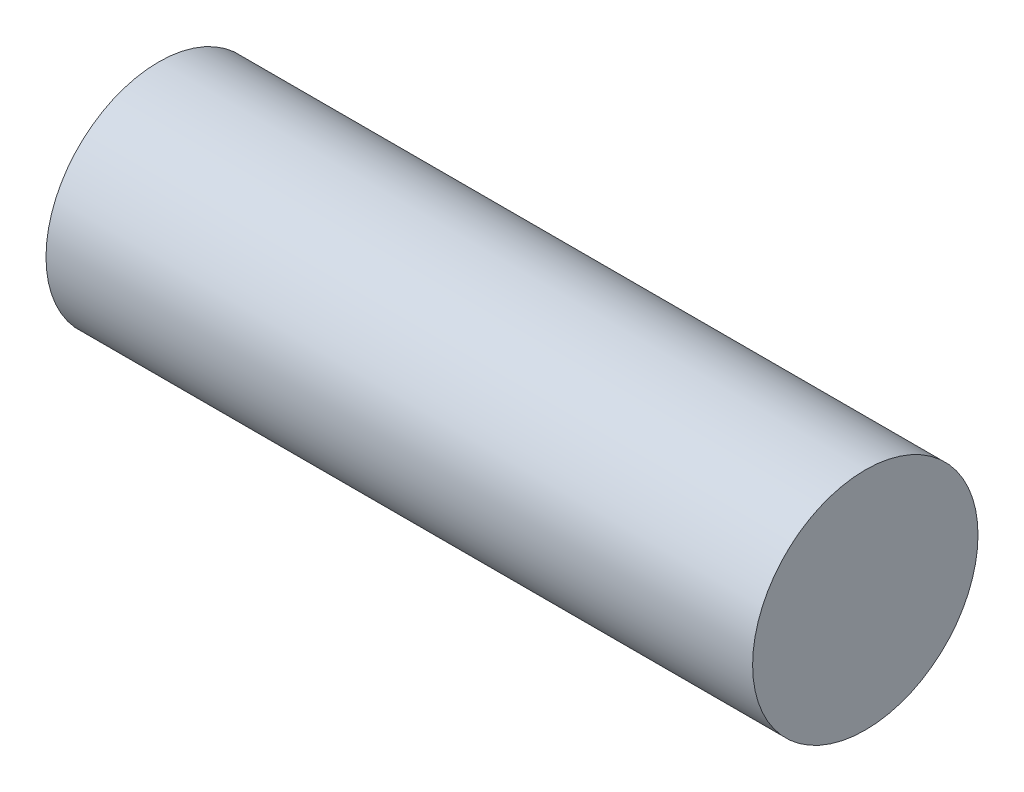
ISO-10303-21;
HEADER;
FILE_DESCRIPTION(('STEP AP214'),'2;1');
FILE_NAME('part.step','',(''),(''),'','','');
FILE_SCHEMA(('AUTOMOTIVE_DESIGN { 1 0 10303 214 1 1 1 1 }'));
ENDSEC;
DATA;
#1=APPLICATION_CONTEXT('core data for automotive mechanical design processes');
#2=APPLICATION_PROTOCOL_DEFINITION('international standard','automotive_design',2000,#1);
#3=PRODUCT_CONTEXT('',#1,'mechanical');
#4=PRODUCT('Part','Part','',(#3));
#5=PRODUCT_RELATED_PRODUCT_CATEGORY('part','',(#4));
#6=PRODUCT_DEFINITION_FORMATION('','',#4);
#7=PRODUCT_DEFINITION_CONTEXT('part definition',#1,'design');
#8=PRODUCT_DEFINITION('design','',#6,#7);
#9=PRODUCT_DEFINITION_SHAPE('','',#8);
#10=(LENGTH_UNIT() NAMED_UNIT(*) SI_UNIT(.MILLI.,.METRE.));
#11=(NAMED_UNIT(*) PLANE_ANGLE_UNIT() SI_UNIT($,.RADIAN.));
#12=(NAMED_UNIT(*) SI_UNIT($,.STERADIAN.) SOLID_ANGLE_UNIT());
#13=UNCERTAINTY_MEASURE_WITH_UNIT(LENGTH_MEASURE(1.E-05),#10,'distance_accuracy_value','');
#14=(GEOMETRIC_REPRESENTATION_CONTEXT(3) GLOBAL_UNCERTAINTY_ASSIGNED_CONTEXT((#13)) GLOBAL_UNIT_ASSIGNED_CONTEXT((#10,
#11,#12)) REPRESENTATION_CONTEXT('',''));
#15=CARTESIAN_POINT('',(0.,0.,0.));
#16=DIRECTION('',(0.,0.,1.));
#17=DIRECTION('',(1.,0.,0.));
#18=AXIS2_PLACEMENT_3D('',#15,#16,#17);
#19=CARTESIAN_POINT('',(58.,0.,0.));
#20=DIRECTION('',(-1.,0.,0.));
#21=DIRECTION('',(0.,0.,1.));
#22=AXIS2_PLACEMENT_3D('',#19,#20,#21);
#23=CYLINDRICAL_SURFACE('',#22,9.25);
#24=CARTESIAN_POINT('',(58.,0.,0.));
#25=DIRECTION('',(1.,0.,0.));
#26=DIRECTION('',(0.,0.,-1.));
#27=AXIS2_PLACEMENT_3D('',#24,#25,#26);
#28=CIRCLE('',#27,9.25);
#29=CARTESIAN_POINT('',(58.,0.,9.25));
#30=VERTEX_POINT('',#29);
#31=EDGE_CURVE('E45',#30,#30,#28,.T.);
#32=CARTESIAN_POINT('',(0.,0.,0.));
#33=DIRECTION('',(1.,0.,0.));
#34=DIRECTION('',(0.,0.,-1.));
#35=AXIS2_PLACEMENT_3D('',#32,#33,#34);
#36=CIRCLE('',#35,9.25);
#37=CARTESIAN_POINT('',(0.,0.,9.25));
#38=VERTEX_POINT('',#37);
#39=EDGE_CURVE('E49',#38,#38,#36,.T.);
#40=CARTESIAN_POINT('',(58.,0.,9.25));
#41=CARTESIAN_POINT('',(57.3958333333333,0.,9.25));
#42=CARTESIAN_POINT('',(56.7916666666667,0.,9.25));
#43=CARTESIAN_POINT('',(55.5833333333333,0.,9.25));
#44=CARTESIAN_POINT('',(54.9791666666667,0.,9.25));
#45=CARTESIAN_POINT('',(53.7708333333333,0.,9.25));
#46=CARTESIAN_POINT('',(53.1666666666667,0.,9.25));
#47=CARTESIAN_POINT('',(51.9583333333333,0.,9.25));
#48=CARTESIAN_POINT('',(51.3541666666667,0.,9.25));
#49=CARTESIAN_POINT('',(50.1458333333333,0.,9.25));
#50=CARTESIAN_POINT('',(49.5416666666667,0.,9.25));
#51=CARTESIAN_POINT('',(48.3333333333333,0.,9.25));
#52=CARTESIAN_POINT('',(47.7291666666667,0.,9.25));
#53=CARTESIAN_POINT('',(46.5208333333333,0.,9.25));
#54=CARTESIAN_POINT('',(45.9166666666667,0.,9.25));
#55=CARTESIAN_POINT('',(44.7083333333333,0.,9.25));
#56=CARTESIAN_POINT('',(44.1041666666667,0.,9.25));
#57=CARTESIAN_POINT('',(42.8958333333333,0.,9.25));
#58=CARTESIAN_POINT('',(42.2916666666667,0.,9.25));
#59=CARTESIAN_POINT('',(41.0833333333333,0.,9.25));
#60=CARTESIAN_POINT('',(40.4791666666667,0.,9.25));
#61=CARTESIAN_POINT('',(39.2708333333333,0.,9.25));
#62=CARTESIAN_POINT('',(38.6666666666667,0.,9.25));
#63=CARTESIAN_POINT('',(37.4583333333333,0.,9.25));
#64=CARTESIAN_POINT('',(36.8541666666667,0.,9.25));
#65=CARTESIAN_POINT('',(35.6458333333333,0.,9.25));
#66=CARTESIAN_POINT('',(35.0416666666667,0.,9.25));
#67=CARTESIAN_POINT('',(33.8333333333333,0.,9.25));
#68=CARTESIAN_POINT('',(33.2291666666667,0.,9.25));
#69=CARTESIAN_POINT('',(32.0208333333333,0.,9.25));
#70=CARTESIAN_POINT('',(31.4166666666667,0.,9.25));
#71=CARTESIAN_POINT('',(30.2083333333333,0.,9.25));
#72=CARTESIAN_POINT('',(29.6041666666667,0.,9.25));
#73=CARTESIAN_POINT('',(28.3958333333333,0.,9.25));
#74=CARTESIAN_POINT('',(27.7916666666667,0.,9.25));
#75=CARTESIAN_POINT('',(26.5833333333333,0.,9.25));
#76=CARTESIAN_POINT('',(25.9791666666667,0.,9.25));
#77=CARTESIAN_POINT('',(24.7708333333333,0.,9.25));
#78=CARTESIAN_POINT('',(24.1666666666667,0.,9.25));
#79=CARTESIAN_POINT('',(22.9583333333333,0.,9.25));
#80=CARTESIAN_POINT('',(22.3541666666667,0.,9.25));
#81=CARTESIAN_POINT('',(21.1458333333333,0.,9.25));
#82=CARTESIAN_POINT('',(20.5416666666667,0.,9.25));
#83=CARTESIAN_POINT('',(19.3333333333333,0.,9.25));
#84=CARTESIAN_POINT('',(18.7291666666667,0.,9.25));
#85=CARTESIAN_POINT('',(17.5208333333333,0.,9.25));
#86=CARTESIAN_POINT('',(16.9166666666667,0.,9.25));
#87=CARTESIAN_POINT('',(15.7083333333333,0.,9.25));
#88=CARTESIAN_POINT('',(15.1041666666667,0.,9.25));
#89=CARTESIAN_POINT('',(13.8958333333333,0.,9.25));
#90=CARTESIAN_POINT('',(13.2916666666667,0.,9.25));
#91=CARTESIAN_POINT('',(12.0833333333333,0.,9.25));
#92=CARTESIAN_POINT('',(11.4791666666667,0.,9.25));
#93=CARTESIAN_POINT('',(10.2708333333333,0.,9.25));
#94=CARTESIAN_POINT('',(9.66666666666667,0.,9.25));
#95=CARTESIAN_POINT('',(8.45833333333333,0.,9.25));
#96=CARTESIAN_POINT('',(7.85416666666667,0.,9.25));
#97=CARTESIAN_POINT('',(6.64583333333333,0.,9.25));
#98=CARTESIAN_POINT('',(6.04166666666667,0.,9.25));
#99=CARTESIAN_POINT('',(4.83333333333333,0.,9.25));
#100=CARTESIAN_POINT('',(4.22916666666667,0.,9.25));
#101=CARTESIAN_POINT('',(3.02083333333334,0.,9.25));
#102=CARTESIAN_POINT('',(2.41666666666667,0.,9.25));
#103=CARTESIAN_POINT('',(1.20833333333333,0.,9.25));
#104=CARTESIAN_POINT('',(0.604166666666666,0.,9.25));
#105=CARTESIAN_POINT('',(0.,0.,9.25));
#106=B_SPLINE_CURVE_WITH_KNOTS('',3,(#40,#41,#42,#43,#44,#45,#46,#47,#48,#49,#50,#51,#52,#53,
#54,#55,#56,#57,#58,#59,#60,#61,#62,#63,#64,#65,#66,#67,#68,#69,#70,#71,#72,#73,#74,#75,#76,#77,
#78,#79,#80,#81,#82,#83,#84,#85,#86,#87,#88,#89,#90,#91,#92,#93,#94,#95,#96,#97,#98,#99,#100,
#101,#102,#103,#104,#105),.UNSPECIFIED.,.F.,.F.,(4,2,2,2,2,2,2,2,2,2,2,2,2,2,2,2,2,2,2,2,2,2,2,
2,2,2,2,2,2,2,2,2,4),(0.,1.8125,3.625,5.4375,7.25000000000001,9.0625,10.875,12.6875,14.5,
16.3125,18.125,19.9375,21.75,23.5625,25.375,27.1875,29.,30.8125,32.625,34.4375,36.25,38.0625,
39.875,41.6875,43.5,45.3125,47.125,48.9375,50.75,52.5625,54.375,56.1875,58.),.UNSPECIFIED.);
#107=EDGE_CURVE('BSEAM35',#30,#38,#106,.T.);
#108=ORIENTED_EDGE('',*,*,#31,.F.);
#109=ORIENTED_EDGE('',*,*,#39,.T.);
#110=ORIENTED_EDGE('',*,*,#107,.T.);
#111=ORIENTED_EDGE('',*,*,#107,.F.);
#112=EDGE_LOOP('',(#108,#110,#109,#111));
#113=FACE_BOUND('',#112,.T.);
#114=ADVANCED_FACE('F35',(#113),#23,.T.);
#115=CARTESIAN_POINT('',(58.,0.,0.));
#116=DIRECTION('',(1.,0.,0.));
#117=DIRECTION('',(0.,0.,-1.));
#118=AXIS2_PLACEMENT_3D('',#115,#116,#117);
#119=PLANE('',#118);
#120=ORIENTED_EDGE('',*,*,#31,.T.);
#121=EDGE_LOOP('',(#120));
#122=FACE_BOUND('',#121,.T.);
#123=ADVANCED_FACE('F76',(#122),#119,.T.);
#124=CARTESIAN_POINT('',(0.,0.,0.));
#125=DIRECTION('',(1.,0.,0.));
#126=DIRECTION('',(0.,0.,-1.));
#127=AXIS2_PLACEMENT_3D('',#124,#125,#126);
#128=PLANE('',#127);
#129=CARTESIAN_POINT('',(0.,-4.,0.));
#130=DIRECTION('',(1.,0.,0.));
#131=DIRECTION('',(0.,0.,-1.));
#132=AXIS2_PLACEMENT_3D('',#129,#130,#131);
#133=CIRCLE('',#132,2.5);
#134=CARTESIAN_POINT('',(0.,-4.,-2.5));
#135=VERTEX_POINT('',#134);
#136=EDGE_CURVE('E10',#135,#135,#133,.F.);
#137=ORIENTED_EDGE('',*,*,#136,.F.);
#138=EDGE_LOOP('',(#137));
#139=FACE_BOUND('',#138,.T.);
#140=CARTESIAN_POINT('',(0.,4.,0.));
#141=DIRECTION('',(1.,0.,0.));
#142=DIRECTION('',(0.,0.,-1.));
#143=AXIS2_PLACEMENT_3D('',#140,#141,#142);
#144=CIRCLE('',#143,2.5);
#145=CARTESIAN_POINT('',(0.,4.,-2.5));
#146=VERTEX_POINT('',#145);
#147=EDGE_CURVE('E41',#146,#146,#144,.F.);
#148=ORIENTED_EDGE('',*,*,#147,.F.);
#149=EDGE_LOOP('',(#148));
#150=FACE_BOUND('',#149,.T.);
#151=ORIENTED_EDGE('',*,*,#39,.F.);
#152=EDGE_LOOP('',(#151));
#153=FACE_BOUND('',#152,.T.);
#154=ADVANCED_FACE('F81',(#139,#150,#153),#128,.F.);
#155=CARTESIAN_POINT('',(-1.,4.,0.));
#156=DIRECTION('',(1.,0.,0.));
#157=DIRECTION('',(0.,0.,-1.));
#158=AXIS2_PLACEMENT_3D('',#155,#156,#157);
#159=CYLINDRICAL_SURFACE('',#158,2.5);
#160=CARTESIAN_POINT('',(-1.,4.,0.));
#161=DIRECTION('',(-1.,0.,0.));
#162=DIRECTION('',(0.,0.,1.));
#163=AXIS2_PLACEMENT_3D('',#160,#161,#162);
#164=CIRCLE('',#163,2.5);
#165=CARTESIAN_POINT('',(-1.,4.,2.5));
#166=VERTEX_POINT('',#165);
#167=EDGE_CURVE('E53',#166,#166,#164,.T.);
#168=ORIENTED_EDGE('',*,*,#167,.F.);
#169=EDGE_LOOP('',(#168));
#170=FACE_BOUND('',#169,.T.);
#171=ORIENTED_EDGE('',*,*,#147,.T.);
#172=EDGE_LOOP('',(#171));
#173=FACE_BOUND('',#172,.T.);
#174=ADVANCED_FACE('F72',(#170,#173),#159,.T.);
#175=CARTESIAN_POINT('',(-1.,4.,0.));
#176=DIRECTION('',(-1.,0.,0.));
#177=DIRECTION('',(0.,0.,1.));
#178=AXIS2_PLACEMENT_3D('',#175,#176,#177);
#179=PLANE('',#178);
#180=ORIENTED_EDGE('',*,*,#167,.T.);
#181=EDGE_LOOP('',(#180));
#182=FACE_BOUND('',#181,.T.);
#183=ADVANCED_FACE('F65',(#182),#179,.T.);
#184=CARTESIAN_POINT('',(-1.,-4.,0.));
#185=DIRECTION('',(1.,0.,0.));
#186=DIRECTION('',(0.,0.,-1.));
#187=AXIS2_PLACEMENT_3D('',#184,#185,#186);
#188=CYLINDRICAL_SURFACE('',#187,2.5);
#189=CARTESIAN_POINT('',(-1.,-4.,0.));
#190=DIRECTION('',(-1.,0.,0.));
#191=DIRECTION('',(0.,0.,-1.));
#192=AXIS2_PLACEMENT_3D('',#189,#190,#191);
#193=CIRCLE('',#192,2.5);
#194=CARTESIAN_POINT('',(-1.,-4.,-2.5));
#195=VERTEX_POINT('',#194);
#196=EDGE_CURVE('E57',#195,#195,#193,.T.);
#197=ORIENTED_EDGE('',*,*,#196,.F.);
#198=EDGE_LOOP('',(#197));
#199=FACE_BOUND('',#198,.T.);
#200=ORIENTED_EDGE('',*,*,#136,.T.);
#201=EDGE_LOOP('',(#200));
#202=FACE_BOUND('',#201,.T.);
#203=ADVANCED_FACE('F63',(#199,#202),#188,.T.);
#204=CARTESIAN_POINT('',(-1.,-4.,0.));
#205=DIRECTION('',(1.,0.,0.));
#206=DIRECTION('',(0.,0.,-1.));
#207=AXIS2_PLACEMENT_3D('',#204,#205,#206);
#208=PLANE('',#207);
#209=ORIENTED_EDGE('',*,*,#196,.T.);
#210=EDGE_LOOP('',(#209));
#211=FACE_BOUND('',#210,.T.);
#212=ADVANCED_FACE('F61',(#211),#208,.F.);
#213=CLOSED_SHELL('',(#114,#123,#154,#174,#183,#203,#212));
#214=MANIFOLD_SOLID_BREP('B2',#213);
#215=ADVANCED_BREP_SHAPE_REPRESENTATION('',(#18,#214),#14);
#216=SHAPE_DEFINITION_REPRESENTATION(#9,#215);
ENDSEC;
END-ISO-10303-21;
